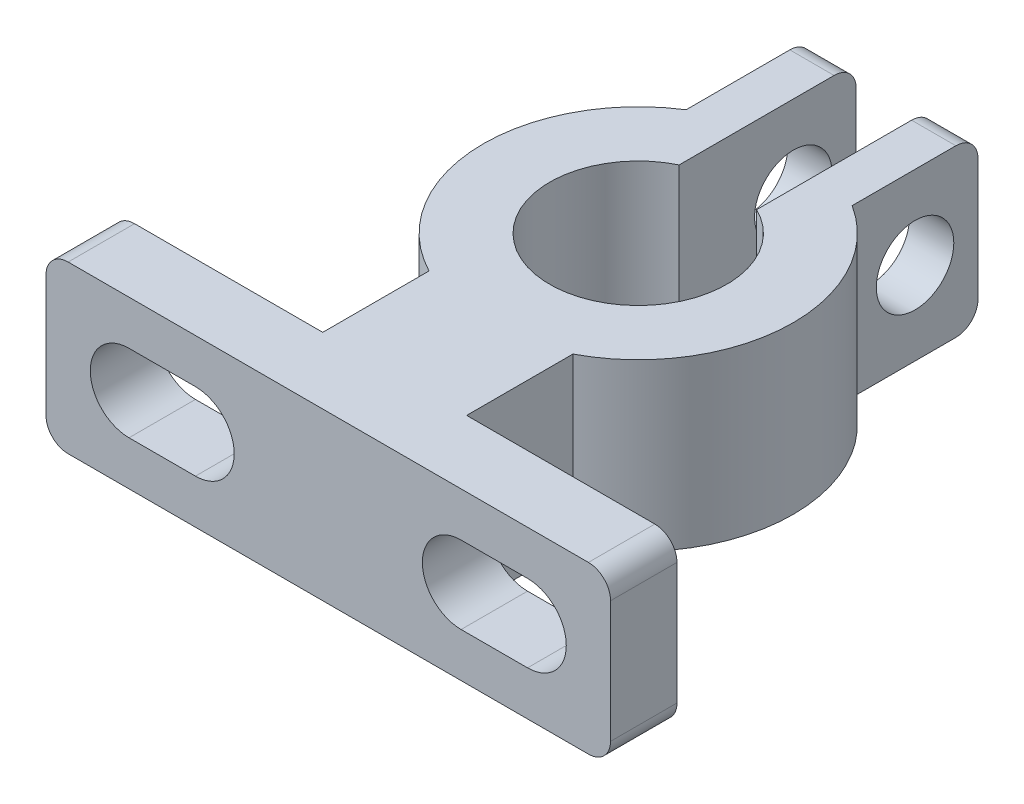
ISO-10303-21;
HEADER;
FILE_DESCRIPTION(('STEP AP214'),'2;1');
FILE_NAME('part.step','',(''),(''),'','','');
FILE_SCHEMA(('AUTOMOTIVE_DESIGN { 1 0 10303 214 1 1 1 1 }'));
ENDSEC;
DATA;
#1=APPLICATION_CONTEXT('core data for automotive mechanical design processes');
#2=APPLICATION_PROTOCOL_DEFINITION('international standard','automotive_design',2000,#1);
#3=PRODUCT_CONTEXT('',#1,'mechanical');
#4=PRODUCT('Part','Part','',(#3));
#5=PRODUCT_RELATED_PRODUCT_CATEGORY('part','',(#4));
#6=PRODUCT_DEFINITION_FORMATION('','',#4);
#7=PRODUCT_DEFINITION_CONTEXT('part definition',#1,'design');
#8=PRODUCT_DEFINITION('design','',#6,#7);
#9=PRODUCT_DEFINITION_SHAPE('','',#8);
#10=(LENGTH_UNIT() NAMED_UNIT(*) SI_UNIT(.MILLI.,.METRE.));
#11=(NAMED_UNIT(*) PLANE_ANGLE_UNIT() SI_UNIT($,.RADIAN.));
#12=(NAMED_UNIT(*) SI_UNIT($,.STERADIAN.) SOLID_ANGLE_UNIT());
#13=UNCERTAINTY_MEASURE_WITH_UNIT(LENGTH_MEASURE(1.E-05),#10,'distance_accuracy_value','');
#14=(GEOMETRIC_REPRESENTATION_CONTEXT(3) GLOBAL_UNCERTAINTY_ASSIGNED_CONTEXT((#13)) GLOBAL_UNIT_ASSIGNED_CONTEXT((#10,
#11,#12)) REPRESENTATION_CONTEXT('',''));
#15=CARTESIAN_POINT('',(0.,0.,0.));
#16=DIRECTION('',(0.,0.,1.));
#17=DIRECTION('',(1.,0.,0.));
#18=AXIS2_PLACEMENT_3D('',#15,#16,#17);
#19=CARTESIAN_POINT('',(-3.25,3.75,-7.));
#20=DIRECTION('',(1.,0.,0.));
#21=DIRECTION('',(0.,0.,-1.));
#22=AXIS2_PLACEMENT_3D('',#19,#20,#21);
#23=PLANE('',#22);
#24=DIRECTION('',(0.,-1.,0.));
#25=VECTOR('',#24,1.);
#26=CARTESIAN_POINT('',(-3.25,3.75,-4.80020161618138));
#27=LINE('',#26,#25);
#28=CARTESIAN_POINT('',(-3.25,-3.75,-4.80020161618138));
#29=VERTEX_POINT('',#28);
#30=CARTESIAN_POINT('',(-3.25,3.75,-4.80020161618138));
#31=VERTEX_POINT('',#30);
#32=EDGE_CURVE('E273',#29,#31,#27,.F.);
#33=ORIENTED_EDGE('',*,*,#32,.F.);
#34=DIRECTION('',(0.,0.,1.));
#35=VECTOR('',#34,1.);
#36=CARTESIAN_POINT('',(-3.25,-3.75,-7.));
#37=LINE('',#36,#35);
#38=CARTESIAN_POINT('',(-3.25,-3.75,0.));
#39=VERTEX_POINT('',#38);
#40=EDGE_CURVE('E336',#29,#39,#37,.T.);
#41=ORIENTED_EDGE('',*,*,#40,.T.);
#42=DIRECTION('',(0.,1.,0.));
#43=VECTOR('',#42,1.);
#44=CARTESIAN_POINT('',(-3.25,3.75,0.));
#45=LINE('',#44,#43);
#46=CARTESIAN_POINT('',(-3.25,3.75,0.));
#47=VERTEX_POINT('',#46);
#48=EDGE_CURVE('E318',#39,#47,#45,.T.);
#49=ORIENTED_EDGE('',*,*,#48,.T.);
#50=DIRECTION('',(0.,0.,1.));
#51=VECTOR('',#50,1.);
#52=CARTESIAN_POINT('',(-3.25,3.75,-7.));
#53=LINE('',#52,#51);
#54=EDGE_CURVE('E340',#31,#47,#53,.T.);
#55=ORIENTED_EDGE('',*,*,#54,.F.);
#56=EDGE_LOOP('',(#33,#41,#49,#55));
#57=FACE_BOUND('',#56,.T.);
#58=ADVANCED_FACE('F37',(#57),#23,.F.);
#59=CARTESIAN_POINT('',(3.25,3.75,-7.));
#60=DIRECTION('',(-1.,0.,0.));
#61=DIRECTION('',(0.,0.,1.));
#62=AXIS2_PLACEMENT_3D('',#59,#60,#61);
#63=PLANE('',#62);
#64=DIRECTION('',(0.,-1.,0.));
#65=VECTOR('',#64,1.);
#66=CARTESIAN_POINT('',(3.25,3.75,-4.80020161618138));
#67=LINE('',#66,#65);
#68=CARTESIAN_POINT('',(3.25,3.75,-4.80020161618138));
#69=VERTEX_POINT('',#68);
#70=CARTESIAN_POINT('',(3.25,-3.75,-4.80020161618138));
#71=VERTEX_POINT('',#70);
#72=EDGE_CURVE('E350',#69,#71,#67,.T.);
#73=ORIENTED_EDGE('',*,*,#72,.F.);
#74=DIRECTION('',(0.,0.,1.));
#75=VECTOR('',#74,1.);
#76=CARTESIAN_POINT('',(3.25,3.75,-7.));
#77=LINE('',#76,#75);
#78=CARTESIAN_POINT('',(3.25,3.75,0.));
#79=VERTEX_POINT('',#78);
#80=EDGE_CURVE('E463',#69,#79,#77,.T.);
#81=ORIENTED_EDGE('',*,*,#80,.T.);
#82=DIRECTION('',(0.,-1.,0.));
#83=VECTOR('',#82,1.);
#84=CARTESIAN_POINT('',(3.25,3.75,0.));
#85=LINE('',#84,#83);
#86=CARTESIAN_POINT('',(3.25,-3.75,0.));
#87=VERTEX_POINT('',#86);
#88=EDGE_CURVE('E327',#79,#87,#85,.T.);
#89=ORIENTED_EDGE('',*,*,#88,.T.);
#90=DIRECTION('',(0.,0.,1.));
#91=VECTOR('',#90,1.);
#92=CARTESIAN_POINT('',(3.25,-3.75,-7.));
#93=LINE('',#92,#91);
#94=EDGE_CURVE('E332',#71,#87,#93,.T.);
#95=ORIENTED_EDGE('',*,*,#94,.F.);
#96=EDGE_LOOP('',(#73,#81,#89,#95));
#97=FACE_BOUND('',#96,.T.);
#98=ADVANCED_FACE('F475',(#97),#63,.F.);
#99=CARTESIAN_POINT('',(0.,0.,0.));
#100=DIRECTION('',(0.,0.,-1.));
#101=DIRECTION('',(-1.,0.,0.));
#102=AXIS2_PLACEMENT_3D('',#99,#100,#101);
#103=PLANE('',#102);
#104=DIRECTION('',(1.,0.,0.));
#105=VECTOR('',#104,1.);
#106=CARTESIAN_POINT('',(-12.75,-3.75,0.));
#107=LINE('',#106,#105);
#108=CARTESIAN_POINT('',(-11.75,-3.75,0.));
#109=VERTEX_POINT('',#108);
#110=EDGE_CURVE('E358',#109,#39,#107,.T.);
#111=ORIENTED_EDGE('',*,*,#110,.F.);
#112=CARTESIAN_POINT('',(-11.75,-2.75,0.));
#113=DIRECTION('',(0.,0.,-1.));
#114=DIRECTION('',(-1.,0.,0.));
#115=AXIS2_PLACEMENT_3D('',#112,#113,#114);
#116=CIRCLE('',#115,1.);
#117=CARTESIAN_POINT('',(-12.75,-2.75,0.));
#118=VERTEX_POINT('',#117);
#119=EDGE_CURVE('E410',#109,#118,#116,.T.);
#120=ORIENTED_EDGE('',*,*,#119,.T.);
#121=DIRECTION('',(0.,-1.,0.));
#122=VECTOR('',#121,1.);
#123=CARTESIAN_POINT('',(-12.75,-3.75,0.));
#124=LINE('',#123,#122);
#125=CARTESIAN_POINT('',(-12.75,2.75,0.));
#126=VERTEX_POINT('',#125);
#127=EDGE_CURVE('E367',#126,#118,#124,.T.);
#128=ORIENTED_EDGE('',*,*,#127,.F.);
#129=CARTESIAN_POINT('',(-11.75,2.75,0.));
#130=DIRECTION('',(0.,0.,-1.));
#131=DIRECTION('',(-1.,0.,0.));
#132=AXIS2_PLACEMENT_3D('',#129,#130,#131);
#133=CIRCLE('',#132,1.);
#134=CARTESIAN_POINT('',(-11.75,3.75,0.));
#135=VERTEX_POINT('',#134);
#136=EDGE_CURVE('E408',#126,#135,#133,.T.);
#137=ORIENTED_EDGE('',*,*,#136,.T.);
#138=DIRECTION('',(-1.,0.,0.));
#139=VECTOR('',#138,1.);
#140=CARTESIAN_POINT('',(-12.75,3.75,0.));
#141=LINE('',#140,#139);
#142=EDGE_CURVE('E372',#47,#135,#141,.T.);
#143=ORIENTED_EDGE('',*,*,#142,.F.);
#144=ORIENTED_EDGE('',*,*,#48,.F.);
#145=EDGE_LOOP('',(#111,#120,#128,#137,#143,#144));
#146=FACE_BOUND('',#145,.T.);
#147=DIRECTION('',(-1.,0.,0.));
#148=VECTOR('',#147,1.);
#149=CARTESIAN_POINT('',(-9.,1.75,0.));
#150=LINE('',#149,#148);
#151=CARTESIAN_POINT('',(-6.,1.75,0.));
#152=VERTEX_POINT('',#151);
#153=CARTESIAN_POINT('',(-9.,1.75,0.));
#154=VERTEX_POINT('',#153);
#155=EDGE_CURVE('E647',#152,#154,#150,.T.);
#156=ORIENTED_EDGE('',*,*,#155,.T.);
#157=CARTESIAN_POINT('',(-9.,0.,0.));
#158=DIRECTION('',(0.,0.,1.));
#159=DIRECTION('',(1.,0.,0.));
#160=AXIS2_PLACEMENT_3D('',#157,#158,#159);
#161=CIRCLE('',#160,1.75);
#162=CARTESIAN_POINT('',(-9.,-1.75,0.));
#163=VERTEX_POINT('',#162);
#164=EDGE_CURVE('E649',#154,#163,#161,.T.);
#165=ORIENTED_EDGE('',*,*,#164,.T.);
#166=DIRECTION('',(1.,0.,0.));
#167=VECTOR('',#166,1.);
#168=CARTESIAN_POINT('',(-9.,-1.75,0.));
#169=LINE('',#168,#167);
#170=CARTESIAN_POINT('',(-6.,-1.75,0.));
#171=VERTEX_POINT('',#170);
#172=EDGE_CURVE('E657',#163,#171,#169,.T.);
#173=ORIENTED_EDGE('',*,*,#172,.T.);
#174=CARTESIAN_POINT('',(-6.,0.,0.));
#175=DIRECTION('',(0.,0.,1.));
#176=DIRECTION('',(1.,0.,0.));
#177=AXIS2_PLACEMENT_3D('',#174,#175,#176);
#178=CIRCLE('',#177,1.75);
#179=EDGE_CURVE('E651',#171,#152,#178,.T.);
#180=ORIENTED_EDGE('',*,*,#179,.T.);
#181=EDGE_LOOP('',(#156,#165,#173,#180));
#182=FACE_BOUND('',#181,.T.);
#183=ADVANCED_FACE('F477',(#146,#182),#103,.T.);
#184=CARTESIAN_POINT('',(0.,0.,3.));
#185=DIRECTION('',(0.,0.,-1.));
#186=DIRECTION('',(-1.,0.,0.));
#187=AXIS2_PLACEMENT_3D('',#184,#185,#186);
#188=PLANE('',#187);
#189=CARTESIAN_POINT('',(-9.,0.,3.));
#190=DIRECTION('',(0.,0.,1.));
#191=DIRECTION('',(1.,0.,0.));
#192=AXIS2_PLACEMENT_3D('',#189,#190,#191);
#193=CIRCLE('',#192,1.75);
#194=CARTESIAN_POINT('',(-9.,1.75,3.));
#195=VERTEX_POINT('',#194);
#196=CARTESIAN_POINT('',(-9.,-1.75,3.));
#197=VERTEX_POINT('',#196);
#198=EDGE_CURVE('E653',#195,#197,#193,.T.);
#199=ORIENTED_EDGE('',*,*,#198,.F.);
#200=DIRECTION('',(-1.,0.,0.));
#201=VECTOR('',#200,1.);
#202=CARTESIAN_POINT('',(-9.,1.75,3.));
#203=LINE('',#202,#201);
#204=CARTESIAN_POINT('',(-6.,1.75,3.));
#205=VERTEX_POINT('',#204);
#206=EDGE_CURVE('E662',#205,#195,#203,.T.);
#207=ORIENTED_EDGE('',*,*,#206,.F.);
#208=CARTESIAN_POINT('',(-6.,0.,3.));
#209=DIRECTION('',(0.,0.,1.));
#210=DIRECTION('',(1.,0.,0.));
#211=AXIS2_PLACEMENT_3D('',#208,#209,#210);
#212=CIRCLE('',#211,1.75);
#213=CARTESIAN_POINT('',(-6.,-1.75,3.));
#214=VERTEX_POINT('',#213);
#215=EDGE_CURVE('E666',#214,#205,#212,.T.);
#216=ORIENTED_EDGE('',*,*,#215,.F.);
#217=DIRECTION('',(1.,0.,0.));
#218=VECTOR('',#217,1.);
#219=CARTESIAN_POINT('',(-9.,-1.75,3.));
#220=LINE('',#219,#218);
#221=EDGE_CURVE('E655',#197,#214,#220,.T.);
#222=ORIENTED_EDGE('',*,*,#221,.F.);
#223=EDGE_LOOP('',(#199,#207,#216,#222));
#224=FACE_BOUND('',#223,.T.);
#225=DIRECTION('',(0.,-1.,0.));
#226=VECTOR('',#225,1.);
#227=CARTESIAN_POINT('',(-12.75,-3.75,3.));
#228=LINE('',#227,#226);
#229=CARTESIAN_POINT('',(-12.75,2.75,3.));
#230=VERTEX_POINT('',#229);
#231=CARTESIAN_POINT('',(-12.75,-2.75,3.));
#232=VERTEX_POINT('',#231);
#233=EDGE_CURVE('E452',#230,#232,#228,.T.);
#234=ORIENTED_EDGE('',*,*,#233,.T.);
#235=CARTESIAN_POINT('',(-11.75,-2.75,3.));
#236=DIRECTION('',(0.,0.,-1.));
#237=DIRECTION('',(-1.,0.,0.));
#238=AXIS2_PLACEMENT_3D('',#235,#236,#237);
#239=CIRCLE('',#238,1.);
#240=CARTESIAN_POINT('',(-11.75,-3.75,3.));
#241=VERTEX_POINT('',#240);
#242=EDGE_CURVE('E423',#232,#241,#239,.F.);
#243=ORIENTED_EDGE('',*,*,#242,.T.);
#244=DIRECTION('',(1.,0.,0.));
#245=VECTOR('',#244,1.);
#246=CARTESIAN_POINT('',(-12.75,-3.75,3.));
#247=LINE('',#246,#245);
#248=CARTESIAN_POINT('',(11.75,-3.75,3.));
#249=VERTEX_POINT('',#248);
#250=EDGE_CURVE('E454',#241,#249,#247,.T.);
#251=ORIENTED_EDGE('',*,*,#250,.T.);
#252=CARTESIAN_POINT('',(11.75,-2.75,3.));
#253=DIRECTION('',(0.,0.,-1.));
#254=DIRECTION('',(-1.,0.,0.));
#255=AXIS2_PLACEMENT_3D('',#252,#253,#254);
#256=CIRCLE('',#255,1.);
#257=CARTESIAN_POINT('',(12.75,-2.75,3.));
#258=VERTEX_POINT('',#257);
#259=EDGE_CURVE('E421',#249,#258,#256,.F.);
#260=ORIENTED_EDGE('',*,*,#259,.T.);
#261=DIRECTION('',(0.,1.,0.));
#262=VECTOR('',#261,1.);
#263=CARTESIAN_POINT('',(12.75,-3.75,3.));
#264=LINE('',#263,#262);
#265=CARTESIAN_POINT('',(12.75,2.75,3.));
#266=VERTEX_POINT('',#265);
#267=EDGE_CURVE('E361',#258,#266,#264,.T.);
#268=ORIENTED_EDGE('',*,*,#267,.T.);
#269=CARTESIAN_POINT('',(11.75,2.75,3.));
#270=DIRECTION('',(0.,0.,-1.));
#271=DIRECTION('',(-1.,0.,0.));
#272=AXIS2_PLACEMENT_3D('',#269,#270,#271);
#273=CIRCLE('',#272,1.);
#274=CARTESIAN_POINT('',(11.75,3.75,3.));
#275=VERTEX_POINT('',#274);
#276=EDGE_CURVE('E419',#266,#275,#273,.F.);
#277=ORIENTED_EDGE('',*,*,#276,.T.);
#278=DIRECTION('',(-1.,0.,0.));
#279=VECTOR('',#278,1.);
#280=CARTESIAN_POINT('',(-12.75,3.75,3.));
#281=LINE('',#280,#279);
#282=CARTESIAN_POINT('',(-11.75,3.75,3.));
#283=VERTEX_POINT('',#282);
#284=EDGE_CURVE('E449',#275,#283,#281,.T.);
#285=ORIENTED_EDGE('',*,*,#284,.T.);
#286=CARTESIAN_POINT('',(-11.75,2.75,3.));
#287=DIRECTION('',(0.,0.,-1.));
#288=DIRECTION('',(-1.,0.,0.));
#289=AXIS2_PLACEMENT_3D('',#286,#287,#288);
#290=CIRCLE('',#289,1.);
#291=EDGE_CURVE('E417',#283,#230,#290,.F.);
#292=ORIENTED_EDGE('',*,*,#291,.T.);
#293=EDGE_LOOP('',(#234,#243,#251,#260,#268,#277,#285,#292));
#294=FACE_BOUND('',#293,.T.);
#295=CARTESIAN_POINT('',(6.,0.,3.));
#296=DIRECTION('',(0.,0.,1.));
#297=DIRECTION('',(1.,0.,0.));
#298=AXIS2_PLACEMENT_3D('',#295,#296,#297);
#299=CIRCLE('',#298,1.75);
#300=CARTESIAN_POINT('',(6.,1.75,3.));
#301=VERTEX_POINT('',#300);
#302=CARTESIAN_POINT('',(6.,-1.75,3.));
#303=VERTEX_POINT('',#302);
#304=EDGE_CURVE('E692',#301,#303,#299,.T.);
#305=ORIENTED_EDGE('',*,*,#304,.F.);
#306=DIRECTION('',(-1.,0.,0.));
#307=VECTOR('',#306,1.);
#308=CARTESIAN_POINT('',(6.,1.75,3.));
#309=LINE('',#308,#307);
#310=CARTESIAN_POINT('',(9.,1.75,3.));
#311=VERTEX_POINT('',#310);
#312=EDGE_CURVE('E688',#311,#301,#309,.T.);
#313=ORIENTED_EDGE('',*,*,#312,.F.);
#314=CARTESIAN_POINT('',(9.,0.,3.));
#315=DIRECTION('',(0.,0.,1.));
#316=DIRECTION('',(1.,0.,0.));
#317=AXIS2_PLACEMENT_3D('',#314,#315,#316);
#318=CIRCLE('',#317,1.75);
#319=CARTESIAN_POINT('',(9.,-1.75,3.));
#320=VERTEX_POINT('',#319);
#321=EDGE_CURVE('E701',#320,#311,#318,.T.);
#322=ORIENTED_EDGE('',*,*,#321,.F.);
#323=DIRECTION('',(1.,0.,0.));
#324=VECTOR('',#323,1.);
#325=CARTESIAN_POINT('',(6.,-1.75,3.));
#326=LINE('',#325,#324);
#327=EDGE_CURVE('E704',#303,#320,#326,.T.);
#328=ORIENTED_EDGE('',*,*,#327,.F.);
#329=EDGE_LOOP('',(#305,#313,#322,#328));
#330=FACE_BOUND('',#329,.T.);
#331=ADVANCED_FACE('F483',(#224,#294,#330),#188,.F.);
#332=DIRECTION('',(0.,1.,0.));
#333=VECTOR('',#332,1.);
#334=CARTESIAN_POINT('',(12.75,-3.75,0.));
#335=LINE('',#334,#333);
#336=CARTESIAN_POINT('',(12.75,-2.75,0.));
#337=VERTEX_POINT('',#336);
#338=CARTESIAN_POINT('',(12.75,2.75,0.));
#339=VERTEX_POINT('',#338);
#340=EDGE_CURVE('E376',#337,#339,#335,.T.);
#341=ORIENTED_EDGE('',*,*,#340,.F.);
#342=CARTESIAN_POINT('',(11.75,-2.75,0.));
#343=DIRECTION('',(0.,0.,-1.));
#344=DIRECTION('',(-1.,0.,0.));
#345=AXIS2_PLACEMENT_3D('',#342,#343,#344);
#346=CIRCLE('',#345,1.);
#347=CARTESIAN_POINT('',(11.75,-3.75,0.));
#348=VERTEX_POINT('',#347);
#349=EDGE_CURVE('E11',#337,#348,#346,.T.);
#350=ORIENTED_EDGE('',*,*,#349,.T.);
#351=EDGE_CURVE('E362',#87,#348,#107,.T.);
#352=ORIENTED_EDGE('',*,*,#351,.F.);
#353=ORIENTED_EDGE('',*,*,#88,.F.);
#354=CARTESIAN_POINT('',(11.75,3.75,0.));
#355=VERTEX_POINT('',#354);
#356=EDGE_CURVE('E375',#355,#79,#141,.T.);
#357=ORIENTED_EDGE('',*,*,#356,.F.);
#358=CARTESIAN_POINT('',(11.75,2.75,0.));
#359=DIRECTION('',(0.,0.,-1.));
#360=DIRECTION('',(-1.,0.,0.));
#361=AXIS2_PLACEMENT_3D('',#358,#359,#360);
#362=CIRCLE('',#361,1.);
#363=EDGE_CURVE('E45',#355,#339,#362,.T.);
#364=ORIENTED_EDGE('',*,*,#363,.T.);
#365=EDGE_LOOP('',(#341,#350,#352,#353,#357,#364));
#366=FACE_BOUND('',#365,.T.);
#367=DIRECTION('',(-1.,0.,0.));
#368=VECTOR('',#367,1.);
#369=CARTESIAN_POINT('',(6.,1.75,0.));
#370=LINE('',#369,#368);
#371=CARTESIAN_POINT('',(9.,1.75,0.));
#372=VERTEX_POINT('',#371);
#373=CARTESIAN_POINT('',(6.,1.75,0.));
#374=VERTEX_POINT('',#373);
#375=EDGE_CURVE('E689',#372,#374,#370,.T.);
#376=ORIENTED_EDGE('',*,*,#375,.T.);
#377=CARTESIAN_POINT('',(6.,0.,0.));
#378=DIRECTION('',(0.,0.,1.));
#379=DIRECTION('',(1.,0.,0.));
#380=AXIS2_PLACEMENT_3D('',#377,#378,#379);
#381=CIRCLE('',#380,1.75);
#382=CARTESIAN_POINT('',(6.,-1.75,0.));
#383=VERTEX_POINT('',#382);
#384=EDGE_CURVE('E471',#374,#383,#381,.T.);
#385=ORIENTED_EDGE('',*,*,#384,.T.);
#386=DIRECTION('',(1.,0.,0.));
#387=VECTOR('',#386,1.);
#388=CARTESIAN_POINT('',(6.,-1.75,0.));
#389=LINE('',#388,#387);
#390=CARTESIAN_POINT('',(9.,-1.75,0.));
#391=VERTEX_POINT('',#390);
#392=EDGE_CURVE('E696',#383,#391,#389,.T.);
#393=ORIENTED_EDGE('',*,*,#392,.T.);
#394=CARTESIAN_POINT('',(9.,0.,0.));
#395=DIRECTION('',(0.,0.,1.));
#396=DIRECTION('',(1.,0.,0.));
#397=AXIS2_PLACEMENT_3D('',#394,#395,#396);
#398=CIRCLE('',#397,1.75);
#399=EDGE_CURVE('E693',#391,#372,#398,.T.);
#400=ORIENTED_EDGE('',*,*,#399,.T.);
#401=EDGE_LOOP('',(#376,#385,#393,#400));
#402=FACE_BOUND('',#401,.T.);
#403=ADVANCED_FACE('F434',(#366,#402),#103,.T.);
#404=CARTESIAN_POINT('',(12.75,-3.75,3.));
#405=DIRECTION('',(-1.,0.,0.));
#406=DIRECTION('',(0.,-1.,0.));
#407=AXIS2_PLACEMENT_3D('',#404,#405,#406);
#408=PLANE('',#407);
#409=ORIENTED_EDGE('',*,*,#267,.F.);
#410=DIRECTION('',(0.,0.,-1.));
#411=VECTOR('',#410,1.);
#412=CARTESIAN_POINT('',(12.75,-2.75,3.));
#413=LINE('',#412,#411);
#414=EDGE_CURVE('E427',#258,#337,#413,.T.);
#415=ORIENTED_EDGE('',*,*,#414,.T.);
#416=ORIENTED_EDGE('',*,*,#340,.T.);
#417=DIRECTION('',(0.,0.,-1.));
#418=VECTOR('',#417,1.);
#419=CARTESIAN_POINT('',(12.75,2.75,3.));
#420=LINE('',#419,#418);
#421=EDGE_CURVE('E425',#339,#266,#420,.F.);
#422=ORIENTED_EDGE('',*,*,#421,.T.);
#423=EDGE_LOOP('',(#409,#415,#416,#422));
#424=FACE_BOUND('',#423,.T.);
#425=ADVANCED_FACE('F430',(#424),#408,.F.);
#426=CARTESIAN_POINT('',(-12.75,3.75,3.));
#427=DIRECTION('',(0.,-1.,0.));
#428=DIRECTION('',(0.,0.,-1.));
#429=AXIS2_PLACEMENT_3D('',#426,#427,#428);
#430=PLANE('',#429);
#431=DIRECTION('',(0.,0.,1.));
#432=VECTOR('',#431,1.);
#433=CARTESIAN_POINT('',(3.75,3.75,0.));
#434=LINE('',#433,#432);
#435=CARTESIAN_POINT('',(3.75,3.75,-21.5968736424845));
#436=VERTEX_POINT('',#435);
#437=CARTESIAN_POINT('',(3.75,3.75,-16.9107952087684));
#438=VERTEX_POINT('',#437);
#439=EDGE_CURVE('E274',#436,#438,#434,.T.);
#440=ORIENTED_EDGE('',*,*,#439,.F.);
#441=DIRECTION('',(-1.,0.,0.));
#442=VECTOR('',#441,1.);
#443=CARTESIAN_POINT('',(-12.75,3.75,-21.5968736424845));
#444=LINE('',#443,#442);
#445=CARTESIAN_POINT('',(1.75,3.75,-21.5968736424845));
#446=VERTEX_POINT('',#445);
#447=EDGE_CURVE('E392',#436,#446,#444,.T.);
#448=ORIENTED_EDGE('',*,*,#447,.T.);
#449=DIRECTION('',(0.,0.,1.));
#450=VECTOR('',#449,1.);
#451=CARTESIAN_POINT('',(1.75,3.75,0.));
#452=LINE('',#451,#450);
#453=CARTESIAN_POINT('',(1.75,3.75,-14.5968736424845));
#454=VERTEX_POINT('',#453);
#455=EDGE_CURVE('E276',#446,#454,#452,.T.);
#456=ORIENTED_EDGE('',*,*,#455,.T.);
#457=CARTESIAN_POINT('',(0.,3.75,-11.));
#458=DIRECTION('',(0.,1.,0.));
#459=DIRECTION('',(0.,0.,1.));
#460=AXIS2_PLACEMENT_3D('',#457,#458,#459);
#461=CIRCLE('',#460,4.);
#462=CARTESIAN_POINT('',(-1.75,3.75,-14.5968736424845));
#463=VERTEX_POINT('',#462);
#464=EDGE_CURVE('E282',#463,#454,#461,.T.);
#465=ORIENTED_EDGE('',*,*,#464,.F.);
#466=DIRECTION('',(0.,0.,1.));
#467=VECTOR('',#466,1.);
#468=CARTESIAN_POINT('',(-1.75,3.75,0.));
#469=LINE('',#468,#467);
#470=CARTESIAN_POINT('',(-1.75,3.75,-21.5968736424845));
#471=VERTEX_POINT('',#470);
#472=EDGE_CURVE('E257',#471,#463,#469,.T.);
#473=ORIENTED_EDGE('',*,*,#472,.F.);
#474=DIRECTION('',(1.,0.,0.));
#475=VECTOR('',#474,1.);
#476=CARTESIAN_POINT('',(-3.75,3.75,-21.5968736424845));
#477=LINE('',#476,#475);
#478=CARTESIAN_POINT('',(-3.75,3.75,-21.5968736424845));
#479=VERTEX_POINT('',#478);
#480=EDGE_CURVE('E253',#471,#479,#477,.F.);
#481=ORIENTED_EDGE('',*,*,#480,.T.);
#482=DIRECTION('',(0.,0.,1.));
#483=VECTOR('',#482,1.);
#484=CARTESIAN_POINT('',(-3.75,3.75,0.));
#485=LINE('',#484,#483);
#486=CARTESIAN_POINT('',(-3.75,3.75,-16.9107952087684));
#487=VERTEX_POINT('',#486);
#488=EDGE_CURVE('E245',#479,#487,#485,.T.);
#489=ORIENTED_EDGE('',*,*,#488,.T.);
#490=CARTESIAN_POINT('',(0.,3.75,-11.));
#491=DIRECTION('',(0.,1.,0.));
#492=DIRECTION('',(0.,0.,1.));
#493=AXIS2_PLACEMENT_3D('',#490,#491,#492);
#494=CIRCLE('',#493,7.);
#495=EDGE_CURVE('E250',#487,#31,#494,.T.);
#496=ORIENTED_EDGE('',*,*,#495,.T.);
#497=ORIENTED_EDGE('',*,*,#54,.T.);
#498=ORIENTED_EDGE('',*,*,#142,.T.);
#499=DIRECTION('',(0.,0.,-1.));
#500=VECTOR('',#499,1.);
#501=CARTESIAN_POINT('',(-11.75,3.75,3.));
#502=LINE('',#501,#500);
#503=EDGE_CURVE('E386',#135,#283,#502,.F.);
#504=ORIENTED_EDGE('',*,*,#503,.T.);
#505=ORIENTED_EDGE('',*,*,#284,.F.);
#506=DIRECTION('',(0.,0.,-1.));
#507=VECTOR('',#506,1.);
#508=CARTESIAN_POINT('',(11.75,3.75,3.));
#509=LINE('',#508,#507);
#510=EDGE_CURVE('E388',#275,#355,#509,.T.);
#511=ORIENTED_EDGE('',*,*,#510,.T.);
#512=ORIENTED_EDGE('',*,*,#356,.T.);
#513=ORIENTED_EDGE('',*,*,#80,.F.);
#514=EDGE_CURVE('E256',#69,#438,#494,.T.);
#515=ORIENTED_EDGE('',*,*,#514,.T.);
#516=EDGE_LOOP('',(#440,#448,#456,#465,#473,#481,#489,#496,#497,#498,#504,#505,#511,#512,#513,#515));
#517=FACE_BOUND('',#516,.T.);
#518=ADVANCED_FACE('F248',(#517),#430,.F.);
#519=CARTESIAN_POINT('',(-12.75,-3.75,3.));
#520=DIRECTION('',(1.,0.,0.));
#521=DIRECTION('',(0.,0.,-1.));
#522=AXIS2_PLACEMENT_3D('',#519,#520,#521);
#523=PLANE('',#522);
#524=ORIENTED_EDGE('',*,*,#127,.T.);
#525=DIRECTION('',(0.,0.,-1.));
#526=VECTOR('',#525,1.);
#527=CARTESIAN_POINT('',(-12.75,-2.75,3.));
#528=LINE('',#527,#526);
#529=EDGE_CURVE('E415',#118,#232,#528,.F.);
#530=ORIENTED_EDGE('',*,*,#529,.T.);
#531=ORIENTED_EDGE('',*,*,#233,.F.);
#532=DIRECTION('',(0.,0.,-1.));
#533=VECTOR('',#532,1.);
#534=CARTESIAN_POINT('',(-12.75,2.75,3.));
#535=LINE('',#534,#533);
#536=EDGE_CURVE('E412',#230,#126,#535,.T.);
#537=ORIENTED_EDGE('',*,*,#536,.T.);
#538=EDGE_LOOP('',(#524,#530,#531,#537));
#539=FACE_BOUND('',#538,.T.);
#540=ADVANCED_FACE('F529',(#539),#523,.F.);
#541=CARTESIAN_POINT('',(-12.75,-3.75,3.));
#542=DIRECTION('',(0.,1.,0.));
#543=DIRECTION('',(0.,0.,1.));
#544=AXIS2_PLACEMENT_3D('',#541,#542,#543);
#545=PLANE('',#544);
#546=DIRECTION('',(0.,0.,1.));
#547=VECTOR('',#546,1.);
#548=CARTESIAN_POINT('',(1.75,-3.75,0.));
#549=LINE('',#548,#547);
#550=CARTESIAN_POINT('',(1.75,-3.75,-21.5968736424845));
#551=VERTEX_POINT('',#550);
#552=CARTESIAN_POINT('',(1.75,-3.75,-14.5968736424845));
#553=VERTEX_POINT('',#552);
#554=EDGE_CURVE('E295',#551,#553,#549,.T.);
#555=ORIENTED_EDGE('',*,*,#554,.F.);
#556=DIRECTION('',(-1.,0.,0.));
#557=VECTOR('',#556,1.);
#558=CARTESIAN_POINT('',(-12.75,-3.75,-21.5968736424845));
#559=LINE('',#558,#557);
#560=CARTESIAN_POINT('',(3.75,-3.75,-21.5968736424845));
#561=VERTEX_POINT('',#560);
#562=EDGE_CURVE('E586',#551,#561,#559,.F.);
#563=ORIENTED_EDGE('',*,*,#562,.T.);
#564=DIRECTION('',(0.,0.,1.));
#565=VECTOR('',#564,1.);
#566=CARTESIAN_POINT('',(3.75,-3.75,0.));
#567=LINE('',#566,#565);
#568=CARTESIAN_POINT('',(3.75,-3.75,-16.9107952087684));
#569=VERTEX_POINT('',#568);
#570=EDGE_CURVE('E293',#561,#569,#567,.T.);
#571=ORIENTED_EDGE('',*,*,#570,.T.);
#572=CARTESIAN_POINT('',(0.,-3.75,-11.));
#573=DIRECTION('',(0.,1.,0.));
#574=DIRECTION('',(0.,0.,1.));
#575=AXIS2_PLACEMENT_3D('',#572,#573,#574);
#576=CIRCLE('',#575,7.);
#577=EDGE_CURVE('E290',#71,#569,#576,.T.);
#578=ORIENTED_EDGE('',*,*,#577,.F.);
#579=ORIENTED_EDGE('',*,*,#94,.T.);
#580=ORIENTED_EDGE('',*,*,#351,.T.);
#581=DIRECTION('',(0.,0.,-1.));
#582=VECTOR('',#581,1.);
#583=CARTESIAN_POINT('',(11.75,-3.75,3.));
#584=LINE('',#583,#582);
#585=EDGE_CURVE('E357',#348,#249,#584,.F.);
#586=ORIENTED_EDGE('',*,*,#585,.T.);
#587=ORIENTED_EDGE('',*,*,#250,.F.);
#588=DIRECTION('',(0.,0.,-1.));
#589=VECTOR('',#588,1.);
#590=CARTESIAN_POINT('',(-11.75,-3.75,3.));
#591=LINE('',#590,#589);
#592=EDGE_CURVE('E582',#241,#109,#591,.T.);
#593=ORIENTED_EDGE('',*,*,#592,.T.);
#594=ORIENTED_EDGE('',*,*,#110,.T.);
#595=ORIENTED_EDGE('',*,*,#40,.F.);
#596=CARTESIAN_POINT('',(-3.75,-3.75,-16.9107952087684));
#597=VERTEX_POINT('',#596);
#598=EDGE_CURVE('E291',#597,#29,#576,.T.);
#599=ORIENTED_EDGE('',*,*,#598,.F.);
#600=DIRECTION('',(0.,0.,1.));
#601=VECTOR('',#600,1.);
#602=CARTESIAN_POINT('',(-3.75,-3.75,0.));
#603=LINE('',#602,#601);
#604=CARTESIAN_POINT('',(-3.75,-3.75,-21.5968736424845));
#605=VERTEX_POINT('',#604);
#606=EDGE_CURVE('E264',#605,#597,#603,.T.);
#607=ORIENTED_EDGE('',*,*,#606,.F.);
#608=DIRECTION('',(1.,0.,0.));
#609=VECTOR('',#608,1.);
#610=CARTESIAN_POINT('',(-1.75,-3.75,-21.5968736424845));
#611=LINE('',#610,#609);
#612=CARTESIAN_POINT('',(-1.75,-3.75,-21.5968736424845));
#613=VERTEX_POINT('',#612);
#614=EDGE_CURVE('E584',#605,#613,#611,.T.);
#615=ORIENTED_EDGE('',*,*,#614,.T.);
#616=DIRECTION('',(0.,0.,1.));
#617=VECTOR('',#616,1.);
#618=CARTESIAN_POINT('',(-1.75,-3.75,0.));
#619=LINE('',#618,#617);
#620=CARTESIAN_POINT('',(-1.75,-3.75,-14.5968736424845));
#621=VERTEX_POINT('',#620);
#622=EDGE_CURVE('E286',#613,#621,#619,.T.);
#623=ORIENTED_EDGE('',*,*,#622,.T.);
#624=CARTESIAN_POINT('',(0.,-3.75,-11.));
#625=DIRECTION('',(0.,1.,0.));
#626=DIRECTION('',(0.,0.,1.));
#627=AXIS2_PLACEMENT_3D('',#624,#625,#626);
#628=CIRCLE('',#627,4.);
#629=EDGE_CURVE('E297',#621,#553,#628,.T.);
#630=ORIENTED_EDGE('',*,*,#629,.T.);
#631=EDGE_LOOP('',(#555,#563,#571,#578,#579,#580,#586,#587,#593,#594,#595,#599,#607,#615,#623,#630));
#632=FACE_BOUND('',#631,.T.);
#633=ADVANCED_FACE('F474',(#632),#545,.F.);
#634=CARTESIAN_POINT('',(-9.,0.,3.));
#635=DIRECTION('',(0.,0.,-1.));
#636=DIRECTION('',(-1.,0.,0.));
#637=AXIS2_PLACEMENT_3D('',#634,#635,#636);
#638=CYLINDRICAL_SURFACE('',#637,1.75);
#639=ORIENTED_EDGE('',*,*,#164,.F.);
#640=DIRECTION('',(0.,0.,-1.));
#641=VECTOR('',#640,1.);
#642=CARTESIAN_POINT('',(-9.,1.75,3.));
#643=LINE('',#642,#641);
#644=EDGE_CURVE('E661',#195,#154,#643,.T.);
#645=ORIENTED_EDGE('',*,*,#644,.F.);
#646=ORIENTED_EDGE('',*,*,#198,.T.);
#647=DIRECTION('',(0.,0.,-1.));
#648=VECTOR('',#647,1.);
#649=CARTESIAN_POINT('',(-9.,-1.75,3.));
#650=LINE('',#649,#648);
#651=EDGE_CURVE('E437',#197,#163,#650,.T.);
#652=ORIENTED_EDGE('',*,*,#651,.T.);
#653=EDGE_LOOP('',(#639,#645,#646,#652));
#654=FACE_BOUND('',#653,.T.);
#655=ADVANCED_FACE('F519',(#654),#638,.F.);
#656=CARTESIAN_POINT('',(-9.,-1.75,3.));
#657=DIRECTION('',(0.,1.,0.));
#658=DIRECTION('',(0.,0.,1.));
#659=AXIS2_PLACEMENT_3D('',#656,#657,#658);
#660=PLANE('',#659);
#661=ORIENTED_EDGE('',*,*,#172,.F.);
#662=ORIENTED_EDGE('',*,*,#651,.F.);
#663=ORIENTED_EDGE('',*,*,#221,.T.);
#664=DIRECTION('',(0.,0.,-1.));
#665=VECTOR('',#664,1.);
#666=CARTESIAN_POINT('',(-6.,-1.75,3.));
#667=LINE('',#666,#665);
#668=EDGE_CURVE('E439',#214,#171,#667,.T.);
#669=ORIENTED_EDGE('',*,*,#668,.T.);
#670=EDGE_LOOP('',(#661,#662,#663,#669));
#671=FACE_BOUND('',#670,.T.);
#672=ADVANCED_FACE('F515',(#671),#660,.T.);
#673=CARTESIAN_POINT('',(-6.,0.,3.));
#674=DIRECTION('',(0.,0.,-1.));
#675=DIRECTION('',(-1.,0.,0.));
#676=AXIS2_PLACEMENT_3D('',#673,#674,#675);
#677=CYLINDRICAL_SURFACE('',#676,1.75);
#678=ORIENTED_EDGE('',*,*,#179,.F.);
#679=ORIENTED_EDGE('',*,*,#668,.F.);
#680=ORIENTED_EDGE('',*,*,#215,.T.);
#681=DIRECTION('',(0.,0.,-1.));
#682=VECTOR('',#681,1.);
#683=CARTESIAN_POINT('',(-6.,1.75,3.));
#684=LINE('',#683,#682);
#685=EDGE_CURVE('E444',#205,#152,#684,.T.);
#686=ORIENTED_EDGE('',*,*,#685,.T.);
#687=EDGE_LOOP('',(#678,#679,#680,#686));
#688=FACE_BOUND('',#687,.T.);
#689=ADVANCED_FACE('F511',(#688),#677,.F.);
#690=CARTESIAN_POINT('',(-9.,1.75,3.));
#691=DIRECTION('',(0.,-1.,0.));
#692=DIRECTION('',(0.,0.,-1.));
#693=AXIS2_PLACEMENT_3D('',#690,#691,#692);
#694=PLANE('',#693);
#695=ORIENTED_EDGE('',*,*,#155,.F.);
#696=ORIENTED_EDGE('',*,*,#685,.F.);
#697=ORIENTED_EDGE('',*,*,#206,.T.);
#698=ORIENTED_EDGE('',*,*,#644,.T.);
#699=EDGE_LOOP('',(#695,#696,#697,#698));
#700=FACE_BOUND('',#699,.T.);
#701=ADVANCED_FACE('F507',(#700),#694,.T.);
#702=CARTESIAN_POINT('',(6.,0.,3.));
#703=DIRECTION('',(0.,0.,-1.));
#704=DIRECTION('',(-1.,0.,0.));
#705=AXIS2_PLACEMENT_3D('',#702,#703,#704);
#706=CYLINDRICAL_SURFACE('',#705,1.75);
#707=ORIENTED_EDGE('',*,*,#384,.F.);
#708=DIRECTION('',(0.,0.,-1.));
#709=VECTOR('',#708,1.);
#710=CARTESIAN_POINT('',(6.,1.75,3.));
#711=LINE('',#710,#709);
#712=EDGE_CURVE('E685',#301,#374,#711,.T.);
#713=ORIENTED_EDGE('',*,*,#712,.F.);
#714=ORIENTED_EDGE('',*,*,#304,.T.);
#715=DIRECTION('',(0.,0.,-1.));
#716=VECTOR('',#715,1.);
#717=CARTESIAN_POINT('',(6.,-1.75,3.));
#718=LINE('',#717,#716);
#719=EDGE_CURVE('E676',#303,#383,#718,.T.);
#720=ORIENTED_EDGE('',*,*,#719,.T.);
#721=EDGE_LOOP('',(#707,#713,#714,#720));
#722=FACE_BOUND('',#721,.T.);
#723=ADVANCED_FACE('F503',(#722),#706,.F.);
#724=CARTESIAN_POINT('',(6.,-1.75,3.));
#725=DIRECTION('',(0.,1.,0.));
#726=DIRECTION('',(-1.,0.,0.));
#727=AXIS2_PLACEMENT_3D('',#724,#725,#726);
#728=PLANE('',#727);
#729=ORIENTED_EDGE('',*,*,#392,.F.);
#730=ORIENTED_EDGE('',*,*,#719,.F.);
#731=ORIENTED_EDGE('',*,*,#327,.T.);
#732=DIRECTION('',(0.,0.,-1.));
#733=VECTOR('',#732,1.);
#734=CARTESIAN_POINT('',(9.,-1.75,3.));
#735=LINE('',#734,#733);
#736=EDGE_CURVE('E678',#320,#391,#735,.T.);
#737=ORIENTED_EDGE('',*,*,#736,.T.);
#738=EDGE_LOOP('',(#729,#730,#731,#737));
#739=FACE_BOUND('',#738,.T.);
#740=ADVANCED_FACE('F499',(#739),#728,.T.);
#741=CARTESIAN_POINT('',(9.,0.,3.));
#742=DIRECTION('',(0.,0.,-1.));
#743=DIRECTION('',(-1.,0.,0.));
#744=AXIS2_PLACEMENT_3D('',#741,#742,#743);
#745=CYLINDRICAL_SURFACE('',#744,1.75);
#746=ORIENTED_EDGE('',*,*,#399,.F.);
#747=ORIENTED_EDGE('',*,*,#736,.F.);
#748=ORIENTED_EDGE('',*,*,#321,.T.);
#749=DIRECTION('',(0.,0.,-1.));
#750=VECTOR('',#749,1.);
#751=CARTESIAN_POINT('',(9.,1.75,3.));
#752=LINE('',#751,#750);
#753=EDGE_CURVE('E681',#311,#372,#752,.T.);
#754=ORIENTED_EDGE('',*,*,#753,.T.);
#755=EDGE_LOOP('',(#746,#747,#748,#754));
#756=FACE_BOUND('',#755,.T.);
#757=ADVANCED_FACE('F495',(#756),#745,.F.);
#758=CARTESIAN_POINT('',(6.,1.75,3.));
#759=DIRECTION('',(0.,-1.,0.));
#760=DIRECTION('',(1.,0.,0.));
#761=AXIS2_PLACEMENT_3D('',#758,#759,#760);
#762=PLANE('',#761);
#763=ORIENTED_EDGE('',*,*,#375,.F.);
#764=ORIENTED_EDGE('',*,*,#753,.F.);
#765=ORIENTED_EDGE('',*,*,#312,.T.);
#766=ORIENTED_EDGE('',*,*,#712,.T.);
#767=EDGE_LOOP('',(#763,#764,#765,#766));
#768=FACE_BOUND('',#767,.T.);
#769=ADVANCED_FACE('F492',(#768),#762,.T.);
#770=CARTESIAN_POINT('',(0.,3.75,-11.));
#771=DIRECTION('',(0.,-1.,0.));
#772=DIRECTION('',(0.,0.,-1.));
#773=AXIS2_PLACEMENT_3D('',#770,#771,#772);
#774=CYLINDRICAL_SURFACE('',#773,7.);
#775=ORIENTED_EDGE('',*,*,#598,.T.);
#776=ORIENTED_EDGE('',*,*,#32,.T.);
#777=ORIENTED_EDGE('',*,*,#495,.F.);
#778=DIRECTION('',(0.,-1.,0.));
#779=VECTOR('',#778,1.);
#780=CARTESIAN_POINT('',(-3.75,3.75,-16.9107952087684));
#781=LINE('',#780,#779);
#782=EDGE_CURVE('E260',#487,#597,#781,.T.);
#783=ORIENTED_EDGE('',*,*,#782,.T.);
#784=EDGE_LOOP('',(#775,#776,#777,#783));
#785=FACE_BOUND('',#784,.T.);
#786=ADVANCED_FACE('F272',(#785),#774,.T.);
#787=ORIENTED_EDGE('',*,*,#514,.F.);
#788=ORIENTED_EDGE('',*,*,#72,.T.);
#789=ORIENTED_EDGE('',*,*,#577,.T.);
#790=DIRECTION('',(0.,-1.,0.));
#791=VECTOR('',#790,1.);
#792=CARTESIAN_POINT('',(3.75,3.75,-16.9107952087684));
#793=LINE('',#792,#791);
#794=EDGE_CURVE('E269',#438,#569,#793,.T.);
#795=ORIENTED_EDGE('',*,*,#794,.F.);
#796=EDGE_LOOP('',(#787,#788,#789,#795));
#797=FACE_BOUND('',#796,.T.);
#798=ADVANCED_FACE('F614',(#797),#774,.T.);
#799=CARTESIAN_POINT('',(0.,3.75,-11.));
#800=DIRECTION('',(0.,-1.,0.));
#801=DIRECTION('',(0.,0.,-1.));
#802=AXIS2_PLACEMENT_3D('',#799,#800,#801);
#803=CYLINDRICAL_SURFACE('',#802,4.);
#804=ORIENTED_EDGE('',*,*,#464,.T.);
#805=DIRECTION('',(0.,-1.,0.));
#806=VECTOR('',#805,1.);
#807=CARTESIAN_POINT('',(1.75,3.75,-14.5968736424845));
#808=LINE('',#807,#806);
#809=EDGE_CURVE('E302',#454,#553,#808,.T.);
#810=ORIENTED_EDGE('',*,*,#809,.T.);
#811=ORIENTED_EDGE('',*,*,#629,.F.);
#812=DIRECTION('',(0.,-1.,0.));
#813=VECTOR('',#812,1.);
#814=CARTESIAN_POINT('',(-1.75,3.75,-14.5968736424845));
#815=LINE('',#814,#813);
#816=EDGE_CURVE('E285',#463,#621,#815,.T.);
#817=ORIENTED_EDGE('',*,*,#816,.F.);
#818=EDGE_LOOP('',(#804,#810,#811,#817));
#819=FACE_BOUND('',#818,.T.);
#820=ADVANCED_FACE('F609',(#819),#803,.F.);
#821=CARTESIAN_POINT('',(-1.75,3.75,0.));
#822=DIRECTION('',(1.,0.,0.));
#823=DIRECTION('',(0.,0.,-1.));
#824=AXIS2_PLACEMENT_3D('',#821,#822,#823);
#825=PLANE('',#824);
#826=CARTESIAN_POINT('',(-1.75,0.,-19.7538344256265));
#827=DIRECTION('',(1.,0.,0.));
#828=DIRECTION('',(0.,0.,-1.));
#829=AXIS2_PLACEMENT_3D('',#826,#827,#828);
#830=CIRCLE('',#829,1.75);
#831=CARTESIAN_POINT('',(-1.75,0.,-21.5038344256265));
#832=VERTEX_POINT('',#831);
#833=EDGE_CURVE('E288',#832,#832,#830,.T.);
#834=ORIENTED_EDGE('',*,*,#833,.F.);
#835=EDGE_LOOP('',(#834));
#836=FACE_BOUND('',#835,.T.);
#837=ORIENTED_EDGE('',*,*,#622,.F.);
#838=CARTESIAN_POINT('',(-1.75,-2.75,-21.5968736424845));
#839=DIRECTION('',(1.,0.,0.));
#840=DIRECTION('',(0.,0.,-1.));
#841=AXIS2_PLACEMENT_3D('',#838,#839,#840);
#842=CIRCLE('',#841,1.);
#843=CARTESIAN_POINT('',(-1.75,-2.75,-22.5968736424845));
#844=VERTEX_POINT('',#843);
#845=EDGE_CURVE('E397',#613,#844,#842,.T.);
#846=ORIENTED_EDGE('',*,*,#845,.T.);
#847=DIRECTION('',(0.,-1.,0.));
#848=VECTOR('',#847,1.);
#849=CARTESIAN_POINT('',(-1.75,3.75,-22.5968736424845));
#850=LINE('',#849,#848);
#851=CARTESIAN_POINT('',(-1.75,2.75,-22.5968736424845));
#852=VERTEX_POINT('',#851);
#853=EDGE_CURVE('E314',#852,#844,#850,.T.);
#854=ORIENTED_EDGE('',*,*,#853,.F.);
#855=CARTESIAN_POINT('',(-1.75,2.75,-21.5968736424845));
#856=DIRECTION('',(1.,0.,0.));
#857=DIRECTION('',(0.,0.,-1.));
#858=AXIS2_PLACEMENT_3D('',#855,#856,#857);
#859=CIRCLE('',#858,1.);
#860=EDGE_CURVE('E395',#852,#471,#859,.T.);
#861=ORIENTED_EDGE('',*,*,#860,.T.);
#862=ORIENTED_EDGE('',*,*,#472,.T.);
#863=ORIENTED_EDGE('',*,*,#816,.T.);
#864=EDGE_LOOP('',(#837,#846,#854,#861,#862,#863));
#865=FACE_BOUND('',#864,.T.);
#866=ADVANCED_FACE('F489',(#836,#865),#825,.T.);
#867=CARTESIAN_POINT('',(0.,3.75,-22.5968736424845));
#868=DIRECTION('',(0.,0.,-1.));
#869=DIRECTION('',(-1.,0.,0.));
#870=AXIS2_PLACEMENT_3D('',#867,#868,#869);
#871=PLANE('',#870);
#872=ORIENTED_EDGE('',*,*,#853,.T.);
#873=DIRECTION('',(1.,0.,0.));
#874=VECTOR('',#873,1.);
#875=CARTESIAN_POINT('',(-3.75,-2.75,-22.5968736424845));
#876=LINE('',#875,#874);
#877=CARTESIAN_POINT('',(-3.75,-2.75,-22.5968736424845));
#878=VERTEX_POINT('',#877);
#879=EDGE_CURVE('E402',#844,#878,#876,.F.);
#880=ORIENTED_EDGE('',*,*,#879,.T.);
#881=DIRECTION('',(0.,-1.,0.));
#882=VECTOR('',#881,1.);
#883=CARTESIAN_POINT('',(-3.75,3.75,-22.5968736424845));
#884=LINE('',#883,#882);
#885=CARTESIAN_POINT('',(-3.75,2.75,-22.5968736424845));
#886=VERTEX_POINT('',#885);
#887=EDGE_CURVE('E268',#886,#878,#884,.T.);
#888=ORIENTED_EDGE('',*,*,#887,.F.);
#889=DIRECTION('',(1.,0.,0.));
#890=VECTOR('',#889,1.);
#891=CARTESIAN_POINT('',(-1.75,2.75,-22.5968736424845));
#892=LINE('',#891,#890);
#893=EDGE_CURVE('E399',#886,#852,#892,.T.);
#894=ORIENTED_EDGE('',*,*,#893,.T.);
#895=EDGE_LOOP('',(#872,#880,#888,#894));
#896=FACE_BOUND('',#895,.T.);
#897=ADVANCED_FACE('F626',(#896),#871,.T.);
#898=CARTESIAN_POINT('',(-3.75,3.75,0.));
#899=DIRECTION('',(1.,0.,0.));
#900=DIRECTION('',(0.,0.,-1.));
#901=AXIS2_PLACEMENT_3D('',#898,#899,#900);
#902=PLANE('',#901);
#903=CARTESIAN_POINT('',(-3.75,0.,-19.7538344256265));
#904=DIRECTION('',(1.,0.,0.));
#905=DIRECTION('',(0.,0.,-1.));
#906=AXIS2_PLACEMENT_3D('',#903,#904,#905);
#907=CIRCLE('',#906,1.75);
#908=CARTESIAN_POINT('',(-3.75,0.,-21.5038344256265));
#909=VERTEX_POINT('',#908);
#910=EDGE_CURVE('E345',#909,#909,#907,.T.);
#911=ORIENTED_EDGE('',*,*,#910,.T.);
#912=EDGE_LOOP('',(#911));
#913=FACE_BOUND('',#912,.T.);
#914=ORIENTED_EDGE('',*,*,#887,.T.);
#915=CARTESIAN_POINT('',(-3.75,-2.75,-21.5968736424845));
#916=DIRECTION('',(1.,0.,0.));
#917=DIRECTION('',(0.,0.,-1.));
#918=AXIS2_PLACEMENT_3D('',#915,#916,#917);
#919=CIRCLE('',#918,1.);
#920=EDGE_CURVE('E406',#878,#605,#919,.F.);
#921=ORIENTED_EDGE('',*,*,#920,.T.);
#922=ORIENTED_EDGE('',*,*,#606,.T.);
#923=ORIENTED_EDGE('',*,*,#782,.F.);
#924=ORIENTED_EDGE('',*,*,#488,.F.);
#925=CARTESIAN_POINT('',(-3.75,2.75,-21.5968736424845));
#926=DIRECTION('',(1.,0.,0.));
#927=DIRECTION('',(0.,0.,-1.));
#928=AXIS2_PLACEMENT_3D('',#925,#926,#927);
#929=CIRCLE('',#928,1.);
#930=EDGE_CURVE('E404',#479,#886,#929,.F.);
#931=ORIENTED_EDGE('',*,*,#930,.T.);
#932=EDGE_LOOP('',(#914,#921,#922,#923,#924,#931));
#933=FACE_BOUND('',#932,.T.);
#934=ADVANCED_FACE('F262',(#913,#933),#902,.F.);
#935=CARTESIAN_POINT('',(3.75,3.75,0.));
#936=DIRECTION('',(1.,0.,0.));
#937=DIRECTION('',(0.,0.,-1.));
#938=AXIS2_PLACEMENT_3D('',#935,#936,#937);
#939=PLANE('',#938);
#940=CARTESIAN_POINT('',(3.75,0.,-19.7538344256265));
#941=DIRECTION('',(1.,0.,0.));
#942=DIRECTION('',(0.,0.,-1.));
#943=AXIS2_PLACEMENT_3D('',#940,#941,#942);
#944=CIRCLE('',#943,1.75);
#945=CARTESIAN_POINT('',(3.75,0.,-21.5038344256265));
#946=VERTEX_POINT('',#945);
#947=EDGE_CURVE('E346',#946,#946,#944,.T.);
#948=ORIENTED_EDGE('',*,*,#947,.F.);
#949=EDGE_LOOP('',(#948));
#950=FACE_BOUND('',#949,.T.);
#951=ORIENTED_EDGE('',*,*,#570,.F.);
#952=CARTESIAN_POINT('',(3.75,-2.75,-21.5968736424845));
#953=DIRECTION('',(1.,0.,0.));
#954=DIRECTION('',(0.,0.,-1.));
#955=AXIS2_PLACEMENT_3D('',#952,#953,#954);
#956=CIRCLE('',#955,1.);
#957=CARTESIAN_POINT('',(3.75,-2.75,-22.5968736424845));
#958=VERTEX_POINT('',#957);
#959=EDGE_CURVE('E384',#561,#958,#956,.T.);
#960=ORIENTED_EDGE('',*,*,#959,.T.);
#961=DIRECTION('',(0.,-1.,0.));
#962=VECTOR('',#961,1.);
#963=CARTESIAN_POINT('',(3.75,3.75,-22.5968736424845));
#964=LINE('',#963,#962);
#965=CARTESIAN_POINT('',(3.75,2.75,-22.5968736424845));
#966=VERTEX_POINT('',#965);
#967=EDGE_CURVE('E308',#966,#958,#964,.T.);
#968=ORIENTED_EDGE('',*,*,#967,.F.);
#969=CARTESIAN_POINT('',(3.75,2.75,-21.5968736424845));
#970=DIRECTION('',(1.,0.,0.));
#971=DIRECTION('',(0.,0.,-1.));
#972=AXIS2_PLACEMENT_3D('',#969,#970,#971);
#973=CIRCLE('',#972,1.);
#974=EDGE_CURVE('E589',#966,#436,#973,.T.);
#975=ORIENTED_EDGE('',*,*,#974,.T.);
#976=ORIENTED_EDGE('',*,*,#439,.T.);
#977=ORIENTED_EDGE('',*,*,#794,.T.);
#978=EDGE_LOOP('',(#951,#960,#968,#975,#976,#977));
#979=FACE_BOUND('',#978,.T.);
#980=ADVANCED_FACE('F595',(#950,#979),#939,.T.);
#981=CARTESIAN_POINT('',(0.,3.75,-22.5968736424845));
#982=DIRECTION('',(0.,0.,1.));
#983=DIRECTION('',(1.,0.,0.));
#984=AXIS2_PLACEMENT_3D('',#981,#982,#983);
#985=PLANE('',#984);
#986=ORIENTED_EDGE('',*,*,#967,.T.);
#987=DIRECTION('',(-1.,0.,0.));
#988=VECTOR('',#987,1.);
#989=CARTESIAN_POINT('',(0.,-2.75,-22.5968736424845));
#990=LINE('',#989,#988);
#991=CARTESIAN_POINT('',(1.75,-2.75,-22.5968736424845));
#992=VERTEX_POINT('',#991);
#993=EDGE_CURVE('E349',#958,#992,#990,.T.);
#994=ORIENTED_EDGE('',*,*,#993,.T.);
#995=DIRECTION('',(0.,-1.,0.));
#996=VECTOR('',#995,1.);
#997=CARTESIAN_POINT('',(1.75,3.75,-22.5968736424845));
#998=LINE('',#997,#996);
#999=CARTESIAN_POINT('',(1.75,2.75,-22.5968736424845));
#1000=VERTEX_POINT('',#999);
#1001=EDGE_CURVE('E305',#1000,#992,#998,.T.);
#1002=ORIENTED_EDGE('',*,*,#1001,.F.);
#1003=DIRECTION('',(-1.,0.,0.));
#1004=VECTOR('',#1003,1.);
#1005=CARTESIAN_POINT('',(0.,2.75,-22.5968736424845));
#1006=LINE('',#1005,#1004);
#1007=EDGE_CURVE('E347',#1000,#966,#1006,.F.);
#1008=ORIENTED_EDGE('',*,*,#1007,.T.);
#1009=EDGE_LOOP('',(#986,#994,#1002,#1008));
#1010=FACE_BOUND('',#1009,.T.);
#1011=ADVANCED_FACE('F599',(#1010),#985,.F.);
#1012=CARTESIAN_POINT('',(1.75,3.75,0.));
#1013=DIRECTION('',(1.,0.,0.));
#1014=DIRECTION('',(0.,0.,-1.));
#1015=AXIS2_PLACEMENT_3D('',#1012,#1013,#1014);
#1016=PLANE('',#1015);
#1017=CARTESIAN_POINT('',(1.75,0.,-19.7538344256265));
#1018=DIRECTION('',(1.,0.,0.));
#1019=DIRECTION('',(0.,0.,-1.));
#1020=AXIS2_PLACEMENT_3D('',#1017,#1018,#1019);
#1021=CIRCLE('',#1020,1.75);
#1022=CARTESIAN_POINT('',(1.75,0.,-21.5038344256265));
#1023=VERTEX_POINT('',#1022);
#1024=EDGE_CURVE('E342',#1023,#1023,#1021,.T.);
#1025=ORIENTED_EDGE('',*,*,#1024,.T.);
#1026=EDGE_LOOP('',(#1025));
#1027=FACE_BOUND('',#1026,.T.);
#1028=ORIENTED_EDGE('',*,*,#1001,.T.);
#1029=CARTESIAN_POINT('',(1.75,-2.75,-21.5968736424845));
#1030=DIRECTION('',(1.,0.,0.));
#1031=DIRECTION('',(0.,0.,-1.));
#1032=AXIS2_PLACEMENT_3D('',#1029,#1030,#1031);
#1033=CIRCLE('',#1032,1.);
#1034=EDGE_CURVE('E355',#992,#551,#1033,.F.);
#1035=ORIENTED_EDGE('',*,*,#1034,.T.);
#1036=ORIENTED_EDGE('',*,*,#554,.T.);
#1037=ORIENTED_EDGE('',*,*,#809,.F.);
#1038=ORIENTED_EDGE('',*,*,#455,.F.);
#1039=CARTESIAN_POINT('',(1.75,2.75,-21.5968736424845));
#1040=DIRECTION('',(1.,0.,0.));
#1041=DIRECTION('',(0.,0.,-1.));
#1042=AXIS2_PLACEMENT_3D('',#1039,#1040,#1041);
#1043=CIRCLE('',#1042,1.);
#1044=EDGE_CURVE('E353',#446,#1000,#1043,.F.);
#1045=ORIENTED_EDGE('',*,*,#1044,.T.);
#1046=EDGE_LOOP('',(#1028,#1035,#1036,#1037,#1038,#1045));
#1047=FACE_BOUND('',#1046,.T.);
#1048=ADVANCED_FACE('F603',(#1027,#1047),#1016,.F.);
#1049=CARTESIAN_POINT('',(-12.750025,0.,-19.7538344256265));
#1050=DIRECTION('',(1.,0.,0.));
#1051=DIRECTION('',(0.,0.,-1.));
#1052=AXIS2_PLACEMENT_3D('',#1049,#1050,#1051);
#1053=CYLINDRICAL_SURFACE('',#1052,1.75);
#1054=ORIENTED_EDGE('',*,*,#947,.T.);
#1055=EDGE_LOOP('',(#1054));
#1056=FACE_BOUND('',#1055,.T.);
#1057=ORIENTED_EDGE('',*,*,#1024,.F.);
#1058=EDGE_LOOP('',(#1057));
#1059=FACE_BOUND('',#1058,.T.);
#1060=ADVANCED_FACE('F721',(#1056,#1059),#1053,.F.);
#1061=ORIENTED_EDGE('',*,*,#833,.T.);
#1062=EDGE_LOOP('',(#1061));
#1063=FACE_BOUND('',#1062,.T.);
#1064=ORIENTED_EDGE('',*,*,#910,.F.);
#1065=EDGE_LOOP('',(#1064));
#1066=FACE_BOUND('',#1065,.T.);
#1067=ADVANCED_FACE('F541',(#1063,#1066),#1053,.F.);
#1068=CARTESIAN_POINT('',(0.,-2.75,-21.5968736424845));
#1069=DIRECTION('',(-1.,0.,0.));
#1070=DIRECTION('',(0.,0.,1.));
#1071=AXIS2_PLACEMENT_3D('',#1068,#1069,#1070);
#1072=CYLINDRICAL_SURFACE('',#1071,1.);
#1073=ORIENTED_EDGE('',*,*,#959,.F.);
#1074=ORIENTED_EDGE('',*,*,#562,.F.);
#1075=ORIENTED_EDGE('',*,*,#1034,.F.);
#1076=ORIENTED_EDGE('',*,*,#993,.F.);
#1077=EDGE_LOOP('',(#1073,#1074,#1075,#1076));
#1078=FACE_BOUND('',#1077,.T.);
#1079=ADVANCED_FACE('F537',(#1078),#1072,.T.);
#1080=CARTESIAN_POINT('',(-12.75,2.75,-21.5968736424845));
#1081=DIRECTION('',(-1.,0.,0.));
#1082=DIRECTION('',(0.,0.,1.));
#1083=AXIS2_PLACEMENT_3D('',#1080,#1081,#1082);
#1084=CYLINDRICAL_SURFACE('',#1083,1.);
#1085=ORIENTED_EDGE('',*,*,#974,.F.);
#1086=ORIENTED_EDGE('',*,*,#1007,.F.);
#1087=ORIENTED_EDGE('',*,*,#1044,.F.);
#1088=ORIENTED_EDGE('',*,*,#447,.F.);
#1089=EDGE_LOOP('',(#1085,#1086,#1087,#1088));
#1090=FACE_BOUND('',#1089,.T.);
#1091=ADVANCED_FACE('F540',(#1090),#1084,.T.);
#1092=CARTESIAN_POINT('',(-12.75,-2.75,-21.5968736424845));
#1093=DIRECTION('',(-1.,0.,0.));
#1094=DIRECTION('',(0.,0.,1.));
#1095=AXIS2_PLACEMENT_3D('',#1092,#1093,#1094);
#1096=CYLINDRICAL_SURFACE('',#1095,1.);
#1097=ORIENTED_EDGE('',*,*,#920,.F.);
#1098=ORIENTED_EDGE('',*,*,#879,.F.);
#1099=ORIENTED_EDGE('',*,*,#845,.F.);
#1100=ORIENTED_EDGE('',*,*,#614,.F.);
#1101=EDGE_LOOP('',(#1097,#1098,#1099,#1100));
#1102=FACE_BOUND('',#1101,.T.);
#1103=ADVANCED_FACE('F545',(#1102),#1096,.T.);
#1104=CARTESIAN_POINT('',(0.,2.75,-21.5968736424845));
#1105=DIRECTION('',(-1.,0.,0.));
#1106=DIRECTION('',(0.,0.,1.));
#1107=AXIS2_PLACEMENT_3D('',#1104,#1105,#1106);
#1108=CYLINDRICAL_SURFACE('',#1107,1.);
#1109=ORIENTED_EDGE('',*,*,#930,.F.);
#1110=ORIENTED_EDGE('',*,*,#480,.F.);
#1111=ORIENTED_EDGE('',*,*,#860,.F.);
#1112=ORIENTED_EDGE('',*,*,#893,.F.);
#1113=EDGE_LOOP('',(#1109,#1110,#1111,#1112));
#1114=FACE_BOUND('',#1113,.T.);
#1115=ADVANCED_FACE('F549',(#1114),#1108,.T.);
#1116=CARTESIAN_POINT('',(-11.75,-2.75,3.));
#1117=DIRECTION('',(0.,0.,-1.));
#1118=DIRECTION('',(-1.,0.,0.));
#1119=AXIS2_PLACEMENT_3D('',#1116,#1117,#1118);
#1120=CYLINDRICAL_SURFACE('',#1119,1.);
#1121=ORIENTED_EDGE('',*,*,#242,.F.);
#1122=ORIENTED_EDGE('',*,*,#529,.F.);
#1123=ORIENTED_EDGE('',*,*,#119,.F.);
#1124=ORIENTED_EDGE('',*,*,#592,.F.);
#1125=EDGE_LOOP('',(#1121,#1122,#1123,#1124));
#1126=FACE_BOUND('',#1125,.T.);
#1127=ADVANCED_FACE('F553',(#1126),#1120,.T.);
#1128=CARTESIAN_POINT('',(11.75,-2.75,3.));
#1129=DIRECTION('',(0.,0.,-1.));
#1130=DIRECTION('',(-1.,0.,0.));
#1131=AXIS2_PLACEMENT_3D('',#1128,#1129,#1130);
#1132=CYLINDRICAL_SURFACE('',#1131,1.);
#1133=ORIENTED_EDGE('',*,*,#259,.F.);
#1134=ORIENTED_EDGE('',*,*,#585,.F.);
#1135=ORIENTED_EDGE('',*,*,#349,.F.);
#1136=ORIENTED_EDGE('',*,*,#414,.F.);
#1137=EDGE_LOOP('',(#1133,#1134,#1135,#1136));
#1138=FACE_BOUND('',#1137,.T.);
#1139=ADVANCED_FACE('F557',(#1138),#1132,.T.);
#1140=CARTESIAN_POINT('',(11.75,2.75,3.));
#1141=DIRECTION('',(0.,0.,-1.));
#1142=DIRECTION('',(-1.,0.,0.));
#1143=AXIS2_PLACEMENT_3D('',#1140,#1141,#1142);
#1144=CYLINDRICAL_SURFACE('',#1143,1.);
#1145=ORIENTED_EDGE('',*,*,#276,.F.);
#1146=ORIENTED_EDGE('',*,*,#421,.F.);
#1147=ORIENTED_EDGE('',*,*,#363,.F.);
#1148=ORIENTED_EDGE('',*,*,#510,.F.);
#1149=EDGE_LOOP('',(#1145,#1146,#1147,#1148));
#1150=FACE_BOUND('',#1149,.T.);
#1151=ADVANCED_FACE('F560',(#1150),#1144,.T.);
#1152=CARTESIAN_POINT('',(-11.75,2.75,3.));
#1153=DIRECTION('',(0.,0.,-1.));
#1154=DIRECTION('',(-1.,0.,0.));
#1155=AXIS2_PLACEMENT_3D('',#1152,#1153,#1154);
#1156=CYLINDRICAL_SURFACE('',#1155,1.);
#1157=ORIENTED_EDGE('',*,*,#291,.F.);
#1158=ORIENTED_EDGE('',*,*,#503,.F.);
#1159=ORIENTED_EDGE('',*,*,#136,.F.);
#1160=ORIENTED_EDGE('',*,*,#536,.F.);
#1161=EDGE_LOOP('',(#1157,#1158,#1159,#1160));
#1162=FACE_BOUND('',#1161,.T.);
#1163=ADVANCED_FACE('F39',(#1162),#1156,.T.);
#1164=CLOSED_SHELL('',(#58,#98,#183,#331,#403,#425,#518,#540,#633,#655,#672,#689,#701,#723,#740,
#757,#769,#786,#798,#820,#866,#897,#934,#980,#1011,#1048,#1060,#1067,#1079,#1091,#1103,#1115,
#1127,#1139,#1151,#1163));
#1165=MANIFOLD_SOLID_BREP('B2',#1164);
#1166=ADVANCED_BREP_SHAPE_REPRESENTATION('',(#18,#1165),#14);
#1167=SHAPE_DEFINITION_REPRESENTATION(#9,#1166);
ENDSEC;
END-ISO-10303-21;
